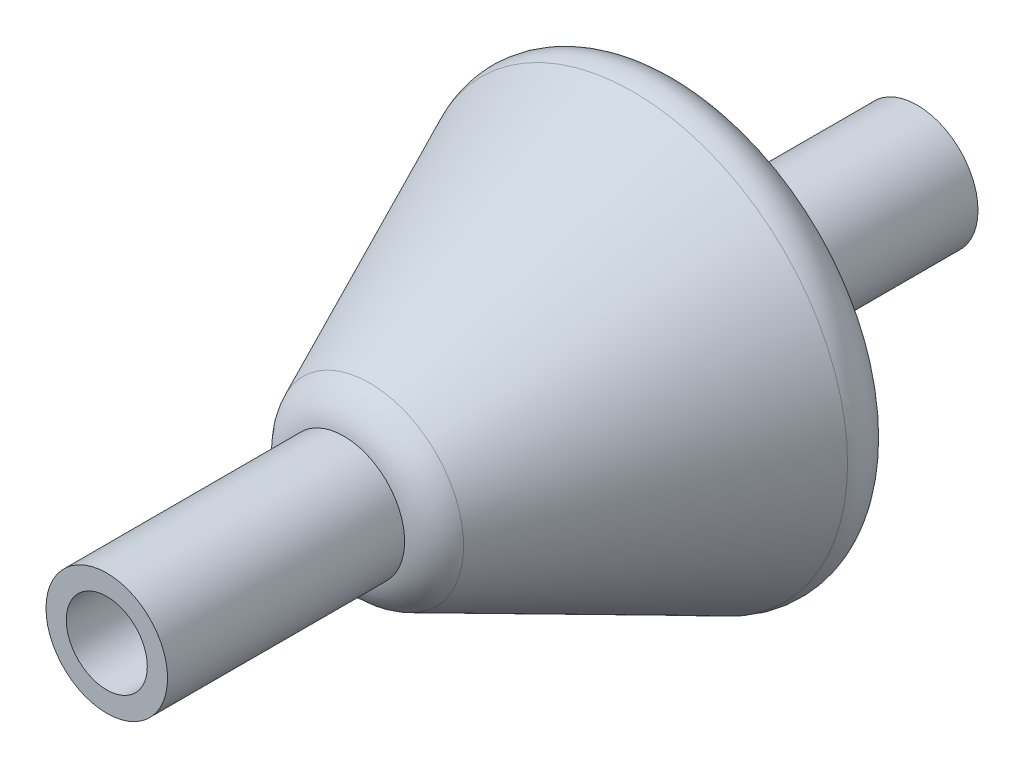
ISO-10303-21;
HEADER;
FILE_DESCRIPTION(('STEP AP214'),'2;1');
FILE_NAME('part.step','',(''),(''),'','','');
FILE_SCHEMA(('AUTOMOTIVE_DESIGN { 1 0 10303 214 1 1 1 1 }'));
ENDSEC;
DATA;
#1=APPLICATION_CONTEXT('core data for automotive mechanical design processes');
#2=APPLICATION_PROTOCOL_DEFINITION('international standard','automotive_design',2000,#1);
#3=PRODUCT_CONTEXT('',#1,'mechanical');
#4=PRODUCT('Part','Part','',(#3));
#5=PRODUCT_RELATED_PRODUCT_CATEGORY('part','',(#4));
#6=PRODUCT_DEFINITION_FORMATION('','',#4);
#7=PRODUCT_DEFINITION_CONTEXT('part definition',#1,'design');
#8=PRODUCT_DEFINITION('design','',#6,#7);
#9=PRODUCT_DEFINITION_SHAPE('','',#8);
#10=(LENGTH_UNIT() NAMED_UNIT(*) SI_UNIT(.MILLI.,.METRE.));
#11=(NAMED_UNIT(*) PLANE_ANGLE_UNIT() SI_UNIT($,.RADIAN.));
#12=(NAMED_UNIT(*) SI_UNIT($,.STERADIAN.) SOLID_ANGLE_UNIT());
#13=UNCERTAINTY_MEASURE_WITH_UNIT(LENGTH_MEASURE(1.E-05),#10,'distance_accuracy_value','');
#14=(GEOMETRIC_REPRESENTATION_CONTEXT(3) GLOBAL_UNCERTAINTY_ASSIGNED_CONTEXT((#13)) GLOBAL_UNIT_ASSIGNED_CONTEXT((#10,
#11,#12)) REPRESENTATION_CONTEXT('',''));
#15=CARTESIAN_POINT('',(0.,0.,0.));
#16=DIRECTION('',(0.,0.,1.));
#17=DIRECTION('',(1.,0.,0.));
#18=AXIS2_PLACEMENT_3D('',#15,#16,#17);
#19=CARTESIAN_POINT('',(0.,0.,60.));
#20=DIRECTION('',(0.,0.,-1.));
#21=DIRECTION('',(-1.,0.,0.));
#22=AXIS2_PLACEMENT_3D('',#19,#20,#21);
#23=CYLINDRICAL_SURFACE('',#22,9.);
#24=CARTESIAN_POINT('',(0.,0.,-25.));
#25=DIRECTION('',(0.,0.,-1.));
#26=DIRECTION('',(-1.,0.,0.));
#27=AXIS2_PLACEMENT_3D('',#24,#25,#26);
#28=CIRCLE('',#27,9.);
#29=CARTESIAN_POINT('',(-9.,0.,-25.));
#30=VERTEX_POINT('',#29);
#31=EDGE_CURVE('E57',#30,#30,#28,.T.);
#32=ORIENTED_EDGE('',*,*,#31,.T.);
#33=EDGE_LOOP('',(#32));
#34=FACE_BOUND('',#33,.T.);
#35=CARTESIAN_POINT('',(0.,0.,-60.));
#36=DIRECTION('',(0.,0.,1.));
#37=DIRECTION('',(1.,0.,0.));
#38=AXIS2_PLACEMENT_3D('',#35,#36,#37);
#39=CIRCLE('',#38,9.);
#40=CARTESIAN_POINT('',(9.,0.,-60.));
#41=VERTEX_POINT('',#40);
#42=EDGE_CURVE('E46',#41,#41,#39,.T.);
#43=ORIENTED_EDGE('',*,*,#42,.T.);
#44=EDGE_LOOP('',(#43));
#45=FACE_BOUND('',#44,.T.);
#46=ADVANCED_FACE('F31',(#34,#45),#23,.T.);
#47=CARTESIAN_POINT('',(0.,0.,60.));
#48=DIRECTION('',(0.,0.,-1.));
#49=DIRECTION('',(-1.,0.,0.));
#50=AXIS2_PLACEMENT_3D('',#47,#48,#49);
#51=CYLINDRICAL_SURFACE('',#50,6.);
#52=CARTESIAN_POINT('',(0.,0.,-25.));
#53=DIRECTION('',(0.,0.,-1.));
#54=DIRECTION('',(-1.,0.,0.));
#55=AXIS2_PLACEMENT_3D('',#52,#53,#54);
#56=CIRCLE('',#55,6.);
#57=CARTESIAN_POINT('',(-6.,0.,-25.));
#58=VERTEX_POINT('',#57);
#59=EDGE_CURVE('E10',#58,#58,#56,.T.);
#60=ORIENTED_EDGE('',*,*,#59,.F.);
#61=EDGE_LOOP('',(#60));
#62=FACE_BOUND('',#61,.T.);
#63=CARTESIAN_POINT('',(0.,0.,-60.));
#64=DIRECTION('',(0.,0.,1.));
#65=DIRECTION('',(1.,0.,0.));
#66=AXIS2_PLACEMENT_3D('',#63,#64,#65);
#67=CIRCLE('',#66,6.);
#68=CARTESIAN_POINT('',(6.,0.,-60.));
#69=VERTEX_POINT('',#68);
#70=EDGE_CURVE('E52',#69,#69,#67,.T.);
#71=ORIENTED_EDGE('',*,*,#70,.F.);
#72=EDGE_LOOP('',(#71));
#73=FACE_BOUND('',#72,.T.);
#74=ADVANCED_FACE('F97',(#62,#73),#51,.F.);
#75=CARTESIAN_POINT('',(0.,0.,-60.));
#76=DIRECTION('',(0.,0.,1.));
#77=DIRECTION('',(1.,0.,0.));
#78=AXIS2_PLACEMENT_3D('',#75,#76,#77);
#79=PLANE('',#78);
#80=ORIENTED_EDGE('',*,*,#42,.F.);
#81=EDGE_LOOP('',(#80));
#82=FACE_BOUND('',#81,.T.);
#83=ORIENTED_EDGE('',*,*,#70,.T.);
#84=EDGE_LOOP('',(#83));
#85=FACE_BOUND('',#84,.T.);
#86=ADVANCED_FACE('F106',(#82,#85),#79,.F.);
#87=CARTESIAN_POINT('',(0.,27.2163264497261,-25.));
#88=DIRECTION('',(0.,0.,-1.));
#89=DIRECTION('',(-1.,0.,0.));
#90=AXIS2_PLACEMENT_3D('',#87,#88,#89);
#91=PLANE('',#90);
#92=ORIENTED_EDGE('',*,*,#59,.T.);
#93=EDGE_LOOP('',(#92));
#94=FACE_BOUND('',#93,.T.);
#95=ADVANCED_FACE('F77',(#94),#91,.T.);
#96=CARTESIAN_POINT('',(0.,0.,18.3050699799898));
#97=DIRECTION('',(0.,0.,-1.));
#98=DIRECTION('',(-1.,0.,0.));
#99=AXIS2_PLACEMENT_3D('',#96,#97,#98);
#100=TOROIDAL_SURFACE('',#99,7.84026386502546,6.69493002001024);
#101=CARTESIAN_POINT('',(0.,0.,21.0887508770344));
#102=DIRECTION('',(0.,0.,-1.));
#103=DIRECTION('',(-1.,0.,0.));
#104=AXIS2_PLACEMENT_3D('',#101,#102,#103);
#105=CIRCLE('',#104,13.9290411344173);
#106=CARTESIAN_POINT('',(-13.9290411344173,0.,21.0887508770344));
#107=VERTEX_POINT('',#106);
#108=EDGE_CURVE('E66',#107,#107,#105,.T.);
#109=ORIENTED_EDGE('',*,*,#108,.F.);
#110=EDGE_LOOP('',(#109));
#111=FACE_BOUND('',#110,.T.);
#112=CARTESIAN_POINT('',(0.,0.,24.8987866913801));
#113=DIRECTION('',(0.,0.,-1.));
#114=DIRECTION('',(-1.,0.,0.));
#115=AXIS2_PLACEMENT_3D('',#112,#113,#114);
#116=CIRCLE('',#115,9.);
#117=CARTESIAN_POINT('',(-9.,0.,24.8987866913801));
#118=VERTEX_POINT('',#117);
#119=EDGE_CURVE('E35',#118,#118,#116,.F.);
#120=ORIENTED_EDGE('',*,*,#119,.F.);
#121=EDGE_LOOP('',(#120));
#122=FACE_BOUND('',#121,.T.);
#123=ADVANCED_FACE('F73',(#111,#122),#100,.T.);
#124=ORIENTED_EDGE('',*,*,#31,.F.);
#125=EDGE_LOOP('',(#124));
#126=FACE_BOUND('',#125,.T.);
#127=CARTESIAN_POINT('',(0.,0.,-25.));
#128=DIRECTION('',(0.,0.,-1.));
#129=DIRECTION('',(-1.,0.,0.));
#130=AXIS2_PLACEMENT_3D('',#127,#128,#129);
#131=CIRCLE('',#130,27.2163264497261);
#132=CARTESIAN_POINT('',(-27.2163264497261,0.,-25.));
#133=VERTEX_POINT('',#132);
#134=EDGE_CURVE('E60',#133,#133,#131,.T.);
#135=ORIENTED_EDGE('',*,*,#134,.T.);
#136=EDGE_LOOP('',(#135));
#137=FACE_BOUND('',#136,.T.);
#138=ADVANCED_FACE('F76',(#126,#137),#91,.T.);
#139=CARTESIAN_POINT('',(0.,0.,-20.));
#140=DIRECTION('',(0.,0.,-1.));
#141=DIRECTION('',(-1.,0.,0.));
#142=AXIS2_PLACEMENT_3D('',#139,#140,#141);
#143=TOROIDAL_SURFACE('',#142,27.2163264497261,5.);
#144=CARTESIAN_POINT('',(0.,0.,-17.9210530291395));
#145=DIRECTION('',(0.,0.,-1.));
#146=DIRECTION('',(-1.,0.,0.));
#147=AXIS2_PLACEMENT_3D('',#144,#145,#146);
#148=CIRCLE('',#147,31.7636310900982);
#149=CARTESIAN_POINT('',(-31.7636310900982,0.,-17.9210530291395));
#150=VERTEX_POINT('',#149);
#151=EDGE_CURVE('E63',#150,#150,#148,.T.);
#152=ORIENTED_EDGE('',*,*,#151,.T.);
#153=EDGE_LOOP('',(#152));
#154=FACE_BOUND('',#153,.T.);
#155=ORIENTED_EDGE('',*,*,#134,.F.);
#156=EDGE_LOOP('',(#155));
#157=FACE_BOUND('',#156,.T.);
#158=ADVANCED_FACE('F127',(#154,#157),#143,.T.);
#159=CARTESIAN_POINT('',(0.,0.,-17.9210530291395));
#160=DIRECTION('',(0.,0.,-1.));
#161=DIRECTION('',(-1.,0.,0.));
#162=AXIS2_PLACEMENT_3D('',#159,#160,#161);
#163=CONICAL_SURFACE('',#162,31.7636310900982,0.428810611235679);
#164=ORIENTED_EDGE('',*,*,#108,.T.);
#165=EDGE_LOOP('',(#164));
#166=FACE_BOUND('',#165,.T.);
#167=ORIENTED_EDGE('',*,*,#151,.F.);
#168=EDGE_LOOP('',(#167));
#169=FACE_BOUND('',#168,.T.);
#170=ADVANCED_FACE('F70',(#166,#169),#163,.T.);
#171=ORIENTED_EDGE('',*,*,#119,.T.);
#172=EDGE_LOOP('',(#171));
#173=FACE_BOUND('',#172,.T.);
#174=CARTESIAN_POINT('',(0.,0.,60.));
#175=DIRECTION('',(0.,0.,1.));
#176=DIRECTION('',(1.,0.,0.));
#177=AXIS2_PLACEMENT_3D('',#174,#175,#176);
#178=CIRCLE('',#177,9.);
#179=CARTESIAN_POINT('',(9.,0.,60.));
#180=VERTEX_POINT('',#179);
#181=EDGE_CURVE('E43',#180,#180,#178,.T.);
#182=ORIENTED_EDGE('',*,*,#181,.F.);
#183=EDGE_LOOP('',(#182));
#184=FACE_BOUND('',#183,.T.);
#185=ADVANCED_FACE('F33',(#173,#184),#23,.T.);
#186=CARTESIAN_POINT('',(0.,0.,60.));
#187=DIRECTION('',(0.,0.,1.));
#188=DIRECTION('',(1.,0.,0.));
#189=AXIS2_PLACEMENT_3D('',#186,#187,#188);
#190=PLANE('',#189);
#191=ORIENTED_EDGE('',*,*,#181,.T.);
#192=EDGE_LOOP('',(#191));
#193=FACE_BOUND('',#192,.T.);
#194=CARTESIAN_POINT('',(0.,0.,60.));
#195=DIRECTION('',(0.,0.,1.));
#196=DIRECTION('',(1.,0.,0.));
#197=AXIS2_PLACEMENT_3D('',#194,#195,#196);
#198=CIRCLE('',#197,6.);
#199=CARTESIAN_POINT('',(6.,0.,60.));
#200=VERTEX_POINT('',#199);
#201=EDGE_CURVE('E49',#200,#200,#198,.T.);
#202=ORIENTED_EDGE('',*,*,#201,.F.);
#203=EDGE_LOOP('',(#202));
#204=FACE_BOUND('',#203,.T.);
#205=ADVANCED_FACE('F84',(#193,#204),#190,.T.);
#206=CARTESIAN_POINT('',(0.,0.,25.));
#207=DIRECTION('',(0.,0.,1.));
#208=DIRECTION('',(1.,0.,0.));
#209=AXIS2_PLACEMENT_3D('',#206,#207,#208);
#210=CIRCLE('',#209,6.);
#211=CARTESIAN_POINT('',(6.,0.,25.));
#212=VERTEX_POINT('',#211);
#213=EDGE_CURVE('E39',#212,#212,#210,.T.);
#214=ORIENTED_EDGE('',*,*,#213,.F.);
#215=EDGE_LOOP('',(#214));
#216=FACE_BOUND('',#215,.T.);
#217=ORIENTED_EDGE('',*,*,#201,.T.);
#218=EDGE_LOOP('',(#217));
#219=FACE_BOUND('',#218,.T.);
#220=ADVANCED_FACE('F89',(#216,#219),#51,.F.);
#221=CARTESIAN_POINT('',(0.,0.,25.));
#222=DIRECTION('',(0.,0.,1.));
#223=DIRECTION('',(1.,0.,0.));
#224=AXIS2_PLACEMENT_3D('',#221,#222,#223);
#225=PLANE('',#224);
#226=ORIENTED_EDGE('',*,*,#213,.T.);
#227=EDGE_LOOP('',(#226));
#228=FACE_BOUND('',#227,.T.);
#229=ADVANCED_FACE('F94',(#228),#225,.T.);
#230=CLOSED_SHELL('',(#46,#74,#86,#95,#123,#138,#158,#170,#185,#205,#220,#229));
#231=MANIFOLD_SOLID_BREP('B2',#230);
#232=ADVANCED_BREP_SHAPE_REPRESENTATION('',(#18,#231),#14);
#233=SHAPE_DEFINITION_REPRESENTATION(#9,#232);
ENDSEC;
END-ISO-10303-21;
